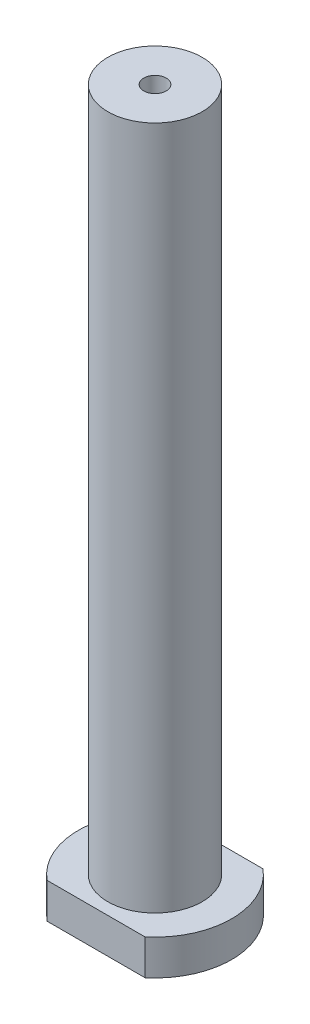
ISO-10303-21;
HEADER;
FILE_DESCRIPTION(('STEP AP214'),'2;1');
FILE_NAME('part.step','',(''),(''),'','','');
FILE_SCHEMA(('AUTOMOTIVE_DESIGN { 1 0 10303 214 1 1 1 1 }'));
ENDSEC;
DATA;
#1=APPLICATION_CONTEXT('core data for automotive mechanical design processes');
#2=APPLICATION_PROTOCOL_DEFINITION('international standard','automotive_design',2000,#1);
#3=PRODUCT_CONTEXT('',#1,'mechanical');
#4=PRODUCT('Part','Part','',(#3));
#5=PRODUCT_RELATED_PRODUCT_CATEGORY('part','',(#4));
#6=PRODUCT_DEFINITION_FORMATION('','',#4);
#7=PRODUCT_DEFINITION_CONTEXT('part definition',#1,'design');
#8=PRODUCT_DEFINITION('design','',#6,#7);
#9=PRODUCT_DEFINITION_SHAPE('','',#8);
#10=(LENGTH_UNIT() NAMED_UNIT(*) SI_UNIT(.MILLI.,.METRE.));
#11=(NAMED_UNIT(*) PLANE_ANGLE_UNIT() SI_UNIT($,.RADIAN.));
#12=(NAMED_UNIT(*) SI_UNIT($,.STERADIAN.) SOLID_ANGLE_UNIT());
#13=UNCERTAINTY_MEASURE_WITH_UNIT(LENGTH_MEASURE(1.E-05),#10,'distance_accuracy_value','');
#14=(GEOMETRIC_REPRESENTATION_CONTEXT(3) GLOBAL_UNCERTAINTY_ASSIGNED_CONTEXT((#13)) GLOBAL_UNIT_ASSIGNED_CONTEXT((#10,
#11,#12)) REPRESENTATION_CONTEXT('',''));
#15=CARTESIAN_POINT('',(0.,0.,0.));
#16=DIRECTION('',(0.,0.,1.));
#17=DIRECTION('',(1.,0.,0.));
#18=AXIS2_PLACEMENT_3D('',#15,#16,#17);
#19=CARTESIAN_POINT('',(0.,3.,0.));
#20=DIRECTION('',(0.,1.,0.));
#21=DIRECTION('',(0.,0.,1.));
#22=AXIS2_PLACEMENT_3D('',#19,#20,#21);
#23=PLANE('',#22);
#24=CARTESIAN_POINT('',(0.,3.,0.));
#25=DIRECTION('',(0.,1.,0.));
#26=DIRECTION('',(0.,0.,1.));
#27=AXIS2_PLACEMENT_3D('',#24,#25,#26);
#28=CIRCLE('',#27,6.5);
#29=CARTESIAN_POINT('',(-4.15331193145904,3.,-5.));
#30=VERTEX_POINT('',#29);
#31=CARTESIAN_POINT('',(-4.15331193145904,3.,5.));
#32=VERTEX_POINT('',#31);
#33=EDGE_CURVE('E92',#30,#32,#28,.T.);
#34=ORIENTED_EDGE('',*,*,#33,.T.);
#35=DIRECTION('',(1.,0.,0.));
#36=VECTOR('',#35,1.);
#37=CARTESIAN_POINT('',(-4.15331193145904,3.,5.));
#38=LINE('',#37,#36);
#39=CARTESIAN_POINT('',(4.15331193145904,3.,5.));
#40=VERTEX_POINT('',#39);
#41=EDGE_CURVE('E87',#32,#40,#38,.T.);
#42=ORIENTED_EDGE('',*,*,#41,.T.);
#43=CARTESIAN_POINT('',(0.,3.,0.));
#44=DIRECTION('',(0.,1.,0.));
#45=DIRECTION('',(0.,0.,1.));
#46=AXIS2_PLACEMENT_3D('',#43,#44,#45);
#47=CIRCLE('',#46,6.5);
#48=CARTESIAN_POINT('',(4.15331193145904,3.,-5.));
#49=VERTEX_POINT('',#48);
#50=EDGE_CURVE('E90',#40,#49,#47,.T.);
#51=ORIENTED_EDGE('',*,*,#50,.T.);
#52=DIRECTION('',(-1.,0.,0.));
#53=VECTOR('',#52,1.);
#54=CARTESIAN_POINT('',(-4.15331193145904,3.,-5.));
#55=LINE('',#54,#53);
#56=EDGE_CURVE('E57',#49,#30,#55,.T.);
#57=ORIENTED_EDGE('',*,*,#56,.T.);
#58=EDGE_LOOP('',(#34,#42,#51,#57));
#59=FACE_BOUND('',#58,.T.);
#60=CARTESIAN_POINT('',(0.,3.,0.));
#61=DIRECTION('',(0.,1.,0.));
#62=DIRECTION('',(0.,0.,1.));
#63=AXIS2_PLACEMENT_3D('',#60,#61,#62);
#64=CIRCLE('',#63,4.);
#65=CARTESIAN_POINT('',(0.,3.,-4.));
#66=VERTEX_POINT('',#65);
#67=EDGE_CURVE('E134',#66,#66,#64,.T.);
#68=ORIENTED_EDGE('',*,*,#67,.F.);
#69=EDGE_LOOP('',(#68));
#70=FACE_BOUND('',#69,.T.);
#71=ADVANCED_FACE('F39',(#59,#70),#23,.T.);
#72=CARTESIAN_POINT('',(0.,0.,0.));
#73=DIRECTION('',(0.,1.,0.));
#74=DIRECTION('',(0.,0.,1.));
#75=AXIS2_PLACEMENT_3D('',#72,#73,#74);
#76=PLANE('',#75);
#77=CARTESIAN_POINT('',(0.,0.,0.));
#78=DIRECTION('',(0.,1.,0.));
#79=DIRECTION('',(0.,0.,1.));
#80=AXIS2_PLACEMENT_3D('',#77,#78,#79);
#81=CIRCLE('',#80,6.5);
#82=CARTESIAN_POINT('',(-4.15331193145904,0.,-5.));
#83=VERTEX_POINT('',#82);
#84=CARTESIAN_POINT('',(-4.15331193145904,0.,5.));
#85=VERTEX_POINT('',#84);
#86=EDGE_CURVE('E108',#83,#85,#81,.T.);
#87=ORIENTED_EDGE('',*,*,#86,.F.);
#88=DIRECTION('',(-1.,0.,0.));
#89=VECTOR('',#88,1.);
#90=CARTESIAN_POINT('',(-4.15331193145904,0.,-5.));
#91=LINE('',#90,#89);
#92=CARTESIAN_POINT('',(4.15331193145904,0.,-5.));
#93=VERTEX_POINT('',#92);
#94=EDGE_CURVE('E80',#93,#83,#91,.T.);
#95=ORIENTED_EDGE('',*,*,#94,.F.);
#96=CARTESIAN_POINT('',(0.,0.,0.));
#97=DIRECTION('',(0.,1.,0.));
#98=DIRECTION('',(0.,0.,1.));
#99=AXIS2_PLACEMENT_3D('',#96,#97,#98);
#100=CIRCLE('',#99,6.5);
#101=CARTESIAN_POINT('',(4.15331193145904,0.,5.));
#102=VERTEX_POINT('',#101);
#103=EDGE_CURVE('E74',#102,#93,#100,.T.);
#104=ORIENTED_EDGE('',*,*,#103,.F.);
#105=DIRECTION('',(1.,0.,0.));
#106=VECTOR('',#105,1.);
#107=CARTESIAN_POINT('',(-4.15331193145904,0.,5.));
#108=LINE('',#107,#106);
#109=EDGE_CURVE('E97',#85,#102,#108,.T.);
#110=ORIENTED_EDGE('',*,*,#109,.F.);
#111=EDGE_LOOP('',(#87,#95,#104,#110));
#112=FACE_BOUND('',#111,.T.);
#113=CARTESIAN_POINT('',(0.,0.,0.));
#114=DIRECTION('',(0.,1.,0.));
#115=DIRECTION('',(0.,0.,1.));
#116=AXIS2_PLACEMENT_3D('',#113,#114,#115);
#117=CIRCLE('',#116,0.95);
#118=CARTESIAN_POINT('',(0.,0.,0.95));
#119=VERTEX_POINT('',#118);
#120=EDGE_CURVE('E112',#119,#119,#117,.T.);
#121=ORIENTED_EDGE('',*,*,#120,.T.);
#122=EDGE_LOOP('',(#121));
#123=FACE_BOUND('',#122,.T.);
#124=ADVANCED_FACE('F125',(#112,#123),#76,.F.);
#125=CARTESIAN_POINT('',(0.,3.,0.));
#126=DIRECTION('',(0.,-1.,0.));
#127=DIRECTION('',(0.,0.,-1.));
#128=AXIS2_PLACEMENT_3D('',#125,#126,#127);
#129=CYLINDRICAL_SURFACE('',#128,6.5);
#130=ORIENTED_EDGE('',*,*,#86,.T.);
#131=DIRECTION('',(0.,-1.,0.));
#132=VECTOR('',#131,1.);
#133=CARTESIAN_POINT('',(-4.15331193145904,3.,5.));
#134=LINE('',#133,#132);
#135=EDGE_CURVE('E11',#32,#85,#134,.T.);
#136=ORIENTED_EDGE('',*,*,#135,.F.);
#137=ORIENTED_EDGE('',*,*,#33,.F.);
#138=DIRECTION('',(0.,-1.,0.));
#139=VECTOR('',#138,1.);
#140=CARTESIAN_POINT('',(-4.15331193145904,3.,-5.));
#141=LINE('',#140,#139);
#142=EDGE_CURVE('E104',#30,#83,#141,.T.);
#143=ORIENTED_EDGE('',*,*,#142,.T.);
#144=EDGE_LOOP('',(#130,#136,#137,#143));
#145=FACE_BOUND('',#144,.T.);
#146=ADVANCED_FACE('F41',(#145),#129,.T.);
#147=CARTESIAN_POINT('',(-4.15331193145904,3.,5.));
#148=DIRECTION('',(0.,0.,-1.));
#149=DIRECTION('',(-1.,0.,0.));
#150=AXIS2_PLACEMENT_3D('',#147,#148,#149);
#151=PLANE('',#150);
#152=ORIENTED_EDGE('',*,*,#109,.T.);
#153=DIRECTION('',(0.,-1.,0.));
#154=VECTOR('',#153,1.);
#155=CARTESIAN_POINT('',(4.15331193145904,3.,5.));
#156=LINE('',#155,#154);
#157=EDGE_CURVE('E49',#40,#102,#156,.T.);
#158=ORIENTED_EDGE('',*,*,#157,.F.);
#159=ORIENTED_EDGE('',*,*,#41,.F.);
#160=ORIENTED_EDGE('',*,*,#135,.T.);
#161=EDGE_LOOP('',(#152,#158,#159,#160));
#162=FACE_BOUND('',#161,.T.);
#163=ADVANCED_FACE('F96',(#162),#151,.F.);
#164=CARTESIAN_POINT('',(0.,3.,0.));
#165=DIRECTION('',(0.,-1.,0.));
#166=DIRECTION('',(0.,0.,-1.));
#167=AXIS2_PLACEMENT_3D('',#164,#165,#166);
#168=CYLINDRICAL_SURFACE('',#167,6.5);
#169=ORIENTED_EDGE('',*,*,#103,.T.);
#170=DIRECTION('',(0.,-1.,0.));
#171=VECTOR('',#170,1.);
#172=CARTESIAN_POINT('',(4.15331193145904,3.,-5.));
#173=LINE('',#172,#171);
#174=EDGE_CURVE('E99',#49,#93,#173,.T.);
#175=ORIENTED_EDGE('',*,*,#174,.F.);
#176=ORIENTED_EDGE('',*,*,#50,.F.);
#177=ORIENTED_EDGE('',*,*,#157,.T.);
#178=EDGE_LOOP('',(#169,#175,#176,#177));
#179=FACE_BOUND('',#178,.T.);
#180=ADVANCED_FACE('F100',(#179),#168,.T.);
#181=CARTESIAN_POINT('',(-4.15331193145904,3.,-5.));
#182=DIRECTION('',(0.,0.,1.));
#183=DIRECTION('',(1.,0.,0.));
#184=AXIS2_PLACEMENT_3D('',#181,#182,#183);
#185=PLANE('',#184);
#186=ORIENTED_EDGE('',*,*,#94,.T.);
#187=ORIENTED_EDGE('',*,*,#142,.F.);
#188=ORIENTED_EDGE('',*,*,#56,.F.);
#189=ORIENTED_EDGE('',*,*,#174,.T.);
#190=EDGE_LOOP('',(#186,#187,#188,#189));
#191=FACE_BOUND('',#190,.T.);
#192=ADVANCED_FACE('F122',(#191),#185,.F.);
#193=CARTESIAN_POINT('',(0.,3.,0.));
#194=DIRECTION('',(0.,-1.,0.));
#195=DIRECTION('',(0.,0.,-1.));
#196=AXIS2_PLACEMENT_3D('',#193,#194,#195);
#197=CYLINDRICAL_SURFACE('',#196,0.95);
#198=ORIENTED_EDGE('',*,*,#120,.F.);
#199=EDGE_LOOP('',(#198));
#200=FACE_BOUND('',#199,.T.);
#201=CARTESIAN_POINT('',(0.,61.,0.));
#202=DIRECTION('',(0.,1.,0.));
#203=DIRECTION('',(0.,0.,1.));
#204=AXIS2_PLACEMENT_3D('',#201,#202,#203);
#205=CIRCLE('',#204,0.95);
#206=CARTESIAN_POINT('',(0.,61.,0.95));
#207=VERTEX_POINT('',#206);
#208=EDGE_CURVE('E138',#207,#207,#205,.T.);
#209=ORIENTED_EDGE('',*,*,#208,.T.);
#210=EDGE_LOOP('',(#209));
#211=FACE_BOUND('',#210,.T.);
#212=ADVANCED_FACE('F146',(#200,#211),#197,.F.);
#213=CARTESIAN_POINT('',(0.,61.,0.));
#214=DIRECTION('',(0.,1.,0.));
#215=DIRECTION('',(0.,0.,1.));
#216=AXIS2_PLACEMENT_3D('',#213,#214,#215);
#217=PLANE('',#216);
#218=CARTESIAN_POINT('',(0.,61.,0.));
#219=DIRECTION('',(0.,1.,0.));
#220=DIRECTION('',(0.,0.,1.));
#221=AXIS2_PLACEMENT_3D('',#218,#219,#220);
#222=CIRCLE('',#221,4.);
#223=CARTESIAN_POINT('',(0.,61.,-4.));
#224=VERTEX_POINT('',#223);
#225=EDGE_CURVE('E133',#224,#224,#222,.T.);
#226=ORIENTED_EDGE('',*,*,#225,.T.);
#227=EDGE_LOOP('',(#226));
#228=FACE_BOUND('',#227,.T.);
#229=ORIENTED_EDGE('',*,*,#208,.F.);
#230=EDGE_LOOP('',(#229));
#231=FACE_BOUND('',#230,.T.);
#232=ADVANCED_FACE('F148',(#228,#231),#217,.T.);
#233=CARTESIAN_POINT('',(0.,61.,0.));
#234=DIRECTION('',(0.,-1.,0.));
#235=DIRECTION('',(0.,0.,-1.));
#236=AXIS2_PLACEMENT_3D('',#233,#234,#235);
#237=CYLINDRICAL_SURFACE('',#236,4.);
#238=CARTESIAN_POINT('',(0.,61.,-4.));
#239=CARTESIAN_POINT('',(0.,60.3958333333333,-4.));
#240=CARTESIAN_POINT('',(0.,59.7916666666667,-4.));
#241=CARTESIAN_POINT('',(0.,58.5833333333333,-4.));
#242=CARTESIAN_POINT('',(0.,57.9791666666667,-4.));
#243=CARTESIAN_POINT('',(0.,56.7708333333333,-4.));
#244=CARTESIAN_POINT('',(0.,56.1666666666667,-4.));
#245=CARTESIAN_POINT('',(0.,54.9583333333333,-4.));
#246=CARTESIAN_POINT('',(0.,54.3541666666667,-4.));
#247=CARTESIAN_POINT('',(0.,53.1458333333333,-4.));
#248=CARTESIAN_POINT('',(0.,52.5416666666667,-4.));
#249=CARTESIAN_POINT('',(0.,51.3333333333333,-4.));
#250=CARTESIAN_POINT('',(0.,50.7291666666667,-4.));
#251=CARTESIAN_POINT('',(0.,49.5208333333333,-4.));
#252=CARTESIAN_POINT('',(0.,48.9166666666667,-4.));
#253=CARTESIAN_POINT('',(0.,47.7083333333333,-4.));
#254=CARTESIAN_POINT('',(0.,47.1041666666667,-4.));
#255=CARTESIAN_POINT('',(0.,45.8958333333333,-4.));
#256=CARTESIAN_POINT('',(0.,45.2916666666667,-4.));
#257=CARTESIAN_POINT('',(0.,44.0833333333333,-4.));
#258=CARTESIAN_POINT('',(0.,43.4791666666667,-4.));
#259=CARTESIAN_POINT('',(0.,42.2708333333333,-4.));
#260=CARTESIAN_POINT('',(0.,41.6666666666667,-4.));
#261=CARTESIAN_POINT('',(0.,40.4583333333333,-4.));
#262=CARTESIAN_POINT('',(0.,39.8541666666667,-4.));
#263=CARTESIAN_POINT('',(0.,38.6458333333333,-4.));
#264=CARTESIAN_POINT('',(0.,38.0416666666667,-4.));
#265=CARTESIAN_POINT('',(0.,36.8333333333333,-4.));
#266=CARTESIAN_POINT('',(0.,36.2291666666667,-4.));
#267=CARTESIAN_POINT('',(0.,35.0208333333333,-4.));
#268=CARTESIAN_POINT('',(0.,34.4166666666667,-4.));
#269=CARTESIAN_POINT('',(0.,33.2083333333333,-4.));
#270=CARTESIAN_POINT('',(0.,32.6041666666667,-4.));
#271=CARTESIAN_POINT('',(0.,31.3958333333333,-4.));
#272=CARTESIAN_POINT('',(0.,30.7916666666667,-4.));
#273=CARTESIAN_POINT('',(0.,29.5833333333333,-4.));
#274=CARTESIAN_POINT('',(0.,28.9791666666667,-4.));
#275=CARTESIAN_POINT('',(0.,27.7708333333333,-4.));
#276=CARTESIAN_POINT('',(0.,27.1666666666667,-4.));
#277=CARTESIAN_POINT('',(0.,25.9583333333333,-4.));
#278=CARTESIAN_POINT('',(0.,25.3541666666667,-4.));
#279=CARTESIAN_POINT('',(0.,24.1458333333333,-4.));
#280=CARTESIAN_POINT('',(0.,23.5416666666667,-4.));
#281=CARTESIAN_POINT('',(0.,22.3333333333333,-4.));
#282=CARTESIAN_POINT('',(0.,21.7291666666667,-4.));
#283=CARTESIAN_POINT('',(0.,20.5208333333333,-4.));
#284=CARTESIAN_POINT('',(0.,19.9166666666667,-4.));
#285=CARTESIAN_POINT('',(0.,18.7083333333333,-4.));
#286=CARTESIAN_POINT('',(0.,18.1041666666667,-4.));
#287=CARTESIAN_POINT('',(0.,16.8958333333333,-4.));
#288=CARTESIAN_POINT('',(0.,16.2916666666667,-4.));
#289=CARTESIAN_POINT('',(0.,15.0833333333333,-4.));
#290=CARTESIAN_POINT('',(0.,14.4791666666667,-4.));
#291=CARTESIAN_POINT('',(0.,13.2708333333333,-4.));
#292=CARTESIAN_POINT('',(0.,12.6666666666667,-4.));
#293=CARTESIAN_POINT('',(0.,11.4583333333333,-4.));
#294=CARTESIAN_POINT('',(0.,10.8541666666667,-4.));
#295=CARTESIAN_POINT('',(0.,9.64583333333333,-4.));
#296=CARTESIAN_POINT('',(0.,9.04166666666667,-4.));
#297=CARTESIAN_POINT('',(0.,7.83333333333334,-4.));
#298=CARTESIAN_POINT('',(0.,7.22916666666667,-4.));
#299=CARTESIAN_POINT('',(0.,6.02083333333334,-4.));
#300=CARTESIAN_POINT('',(0.,5.41666666666667,-4.));
#301=CARTESIAN_POINT('',(0.,4.20833333333334,-4.));
#302=CARTESIAN_POINT('',(0.,3.60416666666667,-4.));
#303=CARTESIAN_POINT('',(0.,3.,-4.));
#304=B_SPLINE_CURVE_WITH_KNOTS('',3,(#238,#239,#240,#241,#242,#243,#244,#245,#246,#247,#248,
#249,#250,#251,#252,#253,#254,#255,#256,#257,#258,#259,#260,#261,#262,#263,#264,#265,#266,#267,
#268,#269,#270,#271,#272,#273,#274,#275,#276,#277,#278,#279,#280,#281,#282,#283,#284,#285,#286,
#287,#288,#289,#290,#291,#292,#293,#294,#295,#296,#297,#298,#299,#300,#301,#302,#303),
.UNSPECIFIED.,.F.,.F.,(4,2,2,2,2,2,2,2,2,2,2,2,2,2,2,2,2,2,2,2,2,2,2,2,2,2,2,2,2,2,2,2,4),(0.,
1.81249999999999,3.625,5.4375,7.24999999999999,9.06249999999999,10.875,12.6875,14.5,16.3125,
18.125,19.9375,21.75,23.5625,25.375,27.1875,29.,30.8125,32.625,34.4375,36.25,38.0625,39.875,
41.6875,43.5,45.3125,47.125,48.9375,50.75,52.5625,54.375,56.1875,58.),.UNSPECIFIED.);
#305=EDGE_CURVE('BSEAM150',#224,#66,#304,.T.);
#306=ORIENTED_EDGE('',*,*,#225,.F.);
#307=ORIENTED_EDGE('',*,*,#67,.T.);
#308=ORIENTED_EDGE('',*,*,#305,.T.);
#309=ORIENTED_EDGE('',*,*,#305,.F.);
#310=EDGE_LOOP('',(#306,#308,#307,#309));
#311=FACE_BOUND('',#310,.T.);
#312=ADVANCED_FACE('F150',(#311),#237,.T.);
#313=CLOSED_SHELL('',(#71,#124,#146,#163,#180,#192,#212,#232,#312));
#314=MANIFOLD_SOLID_BREP('B2',#313);
#315=ADVANCED_BREP_SHAPE_REPRESENTATION('',(#18,#314),#14);
#316=SHAPE_DEFINITION_REPRESENTATION(#9,#315);
ENDSEC;
END-ISO-10303-21;
